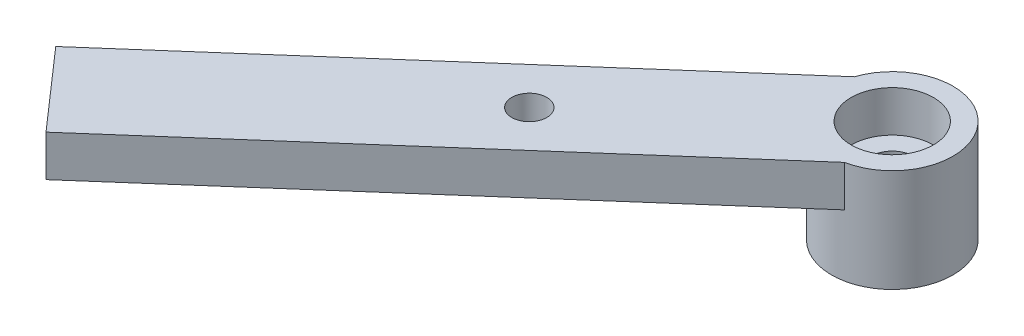
ISO-10303-21;
HEADER;
FILE_DESCRIPTION(('STEP AP214'),'2;1');
FILE_NAME('part.step','',(''),(''),'','','');
FILE_SCHEMA(('AUTOMOTIVE_DESIGN { 1 0 10303 214 1 1 1 1 }'));
ENDSEC;
DATA;
#1=APPLICATION_CONTEXT('core data for automotive mechanical design processes');
#2=APPLICATION_PROTOCOL_DEFINITION('international standard','automotive_design',2000,#1);
#3=PRODUCT_CONTEXT('',#1,'mechanical');
#4=PRODUCT('Part','Part','',(#3));
#5=PRODUCT_RELATED_PRODUCT_CATEGORY('part','',(#4));
#6=PRODUCT_DEFINITION_FORMATION('','',#4);
#7=PRODUCT_DEFINITION_CONTEXT('part definition',#1,'design');
#8=PRODUCT_DEFINITION('design','',#6,#7);
#9=PRODUCT_DEFINITION_SHAPE('','',#8);
#10=(LENGTH_UNIT() NAMED_UNIT(*) SI_UNIT(.MILLI.,.METRE.));
#11=(NAMED_UNIT(*) PLANE_ANGLE_UNIT() SI_UNIT($,.RADIAN.));
#12=(NAMED_UNIT(*) SI_UNIT($,.STERADIAN.) SOLID_ANGLE_UNIT());
#13=UNCERTAINTY_MEASURE_WITH_UNIT(LENGTH_MEASURE(1.E-05),#10,'distance_accuracy_value','');
#14=(GEOMETRIC_REPRESENTATION_CONTEXT(3) GLOBAL_UNCERTAINTY_ASSIGNED_CONTEXT((#13)) GLOBAL_UNIT_ASSIGNED_CONTEXT((#10,
#11,#12)) REPRESENTATION_CONTEXT('',''));
#15=CARTESIAN_POINT('',(0.,0.,0.));
#16=DIRECTION('',(0.,0.,1.));
#17=DIRECTION('',(1.,0.,0.));
#18=AXIS2_PLACEMENT_3D('',#15,#16,#17);
#19=CARTESIAN_POINT('',(-54.3717723606613,16.1569540318952,211.624669078813));
#20=DIRECTION('',(0.,1.,0.));
#21=DIRECTION('',(-1.,0.,0.));
#22=AXIS2_PLACEMENT_3D('',#19,#20,#21);
#23=PLANE('',#22);
#24=CARTESIAN_POINT('',(-73.1695544206689,16.1569540318952,228.106276695319));
#25=DIRECTION('',(0.,-1.,0.));
#26=DIRECTION('',(1.,0.,0.));
#27=AXIS2_PLACEMENT_3D('',#24,#25,#26);
#28=CIRCLE('',#27,1.70000000000001);
#29=CARTESIAN_POINT('',(-71.4695544206689,16.1569540318952,228.106276695319));
#30=VERTEX_POINT('',#29);
#31=EDGE_CURVE('E168',#30,#30,#28,.T.);
#32=ORIENTED_EDGE('',*,*,#31,.F.);
#33=EDGE_LOOP('',(#32));
#34=FACE_BOUND('',#33,.T.);
#35=CARTESIAN_POINT('',(-54.3717723606613,16.1569540318952,211.624669078813));
#36=DIRECTION('',(0.,-1.,0.));
#37=DIRECTION('',(1.,0.,0.));
#38=AXIS2_PLACEMENT_3D('',#35,#36,#37);
#39=CIRCLE('',#38,5.90000000000027);
#40=CARTESIAN_POINT('',(-53.2248893633556,16.1569540318952,217.412126153427));
#41=VERTEX_POINT('',#40);
#42=CARTESIAN_POINT('',(-59.9596082089397,16.1569540318952,209.730971496648));
#43=VERTEX_POINT('',#42);
#44=EDGE_CURVE('E88',#41,#43,#39,.T.);
#45=ORIENTED_EDGE('',*,*,#44,.F.);
#46=DIRECTION('',(0.751911282400303,0.,-0.659264304660227));
#47=VECTOR('',#46,1.);
#48=CARTESIAN_POINT('',(-94.5800098953721,16.1569540318952,253.671662909739));
#49=LINE('',#48,#47);
#50=CARTESIAN_POINT('',(-94.5800098953721,16.1569540318952,253.671662909739));
#51=VERTEX_POINT('',#50);
#52=EDGE_CURVE('E95',#51,#41,#49,.T.);
#53=ORIENTED_EDGE('',*,*,#52,.F.);
#54=DIRECTION('',(0.65926430466023,0.,0.7519112824003));
#55=VECTOR('',#54,1.);
#56=CARTESIAN_POINT('',(-101.314728740956,16.1569540318952,245.99050825296));
#57=LINE('',#56,#55);
#58=CARTESIAN_POINT('',(-101.314728740956,16.1569540318952,245.99050825296));
#59=VERTEX_POINT('',#58);
#60=EDGE_CURVE('E106',#59,#51,#57,.T.);
#61=ORIENTED_EDGE('',*,*,#60,.F.);
#62=DIRECTION('',(-0.751911282400303,0.,0.659264304660227));
#63=VECTOR('',#62,1.);
#64=CARTESIAN_POINT('',(-59.9596082089397,16.1569540318952,209.730971496648));
#65=LINE('',#64,#63);
#66=EDGE_CURVE('E97',#43,#59,#65,.T.);
#67=ORIENTED_EDGE('',*,*,#66,.F.);
#68=EDGE_LOOP('',(#45,#53,#61,#67));
#69=FACE_BOUND('',#68,.T.);
#70=ADVANCED_FACE('F48',(#34,#69),#23,.F.);
#71=CARTESIAN_POINT('',(-54.3717723606613,16.1569540318952,211.624669078813));
#72=DIRECTION('',(0.,1.,0.));
#73=DIRECTION('',(-1.,0.,0.));
#74=AXIS2_PLACEMENT_3D('',#71,#72,#73);
#75=CYLINDRICAL_SURFACE('',#74,5.90000000000026);
#76=CARTESIAN_POINT('',(-54.3717723606613,20.1569540318952,211.624669078813));
#77=DIRECTION('',(0.,1.,0.));
#78=DIRECTION('',(-1.,0.,0.));
#79=AXIS2_PLACEMENT_3D('',#76,#77,#78);
#80=CIRCLE('',#79,5.90000000000026);
#81=CARTESIAN_POINT('',(-53.2248893633556,20.1569540318952,217.412126153427));
#82=VERTEX_POINT('',#81);
#83=CARTESIAN_POINT('',(-59.9596082089397,20.1569540318952,209.730971496648));
#84=VERTEX_POINT('',#83);
#85=EDGE_CURVE('E103',#82,#84,#80,.T.);
#86=ORIENTED_EDGE('',*,*,#85,.F.);
#87=DIRECTION('',(0.,1.,0.));
#88=VECTOR('',#87,1.);
#89=CARTESIAN_POINT('',(-53.2248893633556,16.1569540318952,217.412126153427));
#90=LINE('',#89,#88);
#91=EDGE_CURVE('E12',#41,#82,#90,.T.);
#92=ORIENTED_EDGE('',*,*,#91,.F.);
#93=ORIENTED_EDGE('',*,*,#44,.T.);
#94=DIRECTION('',(0.,1.,0.));
#95=VECTOR('',#94,1.);
#96=CARTESIAN_POINT('',(-59.9596082089397,16.1569540318952,209.730971496648));
#97=LINE('',#96,#95);
#98=EDGE_CURVE('E52',#43,#84,#97,.T.);
#99=ORIENTED_EDGE('',*,*,#98,.T.);
#100=EDGE_LOOP('',(#86,#92,#93,#99));
#101=FACE_BOUND('',#100,.T.);
#102=CARTESIAN_POINT('',(-54.3717723606613,10.1569540318952,211.624669078813));
#103=DIRECTION('',(0.,-1.,0.));
#104=DIRECTION('',(1.,0.,0.));
#105=AXIS2_PLACEMENT_3D('',#102,#103,#104);
#106=CIRCLE('',#105,5.90000000000027);
#107=CARTESIAN_POINT('',(-48.471772360661,10.1569540318951,211.624669078813));
#108=VERTEX_POINT('',#107);
#109=EDGE_CURVE('E98',#108,#108,#106,.T.);
#110=ORIENTED_EDGE('',*,*,#109,.F.);
#111=EDGE_LOOP('',(#110));
#112=FACE_BOUND('',#111,.T.);
#113=ADVANCED_FACE('F50',(#101,#112),#75,.T.);
#114=CARTESIAN_POINT('',(-94.5800098953721,16.1569540318952,253.671662909739));
#115=DIRECTION('',(0.659264304660227,0.,0.751911282400303));
#116=DIRECTION('',(0.751911282400303,0.,-0.659264304660227));
#117=AXIS2_PLACEMENT_3D('',#114,#115,#116);
#118=PLANE('',#117);
#119=DIRECTION('',(0.751911282400303,0.,-0.659264304660227));
#120=VECTOR('',#119,1.);
#121=CARTESIAN_POINT('',(-94.5800098953721,20.1569540318952,253.671662909739));
#122=LINE('',#121,#120);
#123=CARTESIAN_POINT('',(-94.5800098953721,20.1569540318952,253.671662909739));
#124=VERTEX_POINT('',#123);
#125=EDGE_CURVE('E119',#124,#82,#122,.T.);
#126=ORIENTED_EDGE('',*,*,#125,.F.);
#127=DIRECTION('',(0.,1.,0.));
#128=VECTOR('',#127,1.);
#129=CARTESIAN_POINT('',(-94.5800098953721,16.1569540318952,253.671662909739));
#130=LINE('',#129,#128);
#131=EDGE_CURVE('E58',#51,#124,#130,.T.);
#132=ORIENTED_EDGE('',*,*,#131,.F.);
#133=ORIENTED_EDGE('',*,*,#52,.T.);
#134=ORIENTED_EDGE('',*,*,#91,.T.);
#135=EDGE_LOOP('',(#126,#132,#133,#134));
#136=FACE_BOUND('',#135,.T.);
#137=ADVANCED_FACE('F105',(#136),#118,.T.);
#138=CARTESIAN_POINT('',(-101.314728740956,16.1569540318952,245.99050825296));
#139=DIRECTION('',(-0.7519112824003,0.,0.65926430466023));
#140=DIRECTION('',(0.65926430466023,0.,0.7519112824003));
#141=AXIS2_PLACEMENT_3D('',#138,#139,#140);
#142=PLANE('',#141);
#143=DIRECTION('',(0.65926430466023,0.,0.7519112824003));
#144=VECTOR('',#143,1.);
#145=CARTESIAN_POINT('',(-101.314728740956,20.1569540318952,245.99050825296));
#146=LINE('',#145,#144);
#147=CARTESIAN_POINT('',(-101.314728740956,20.1569540318952,245.99050825296));
#148=VERTEX_POINT('',#147);
#149=EDGE_CURVE('E117',#148,#124,#146,.T.);
#150=ORIENTED_EDGE('',*,*,#149,.F.);
#151=DIRECTION('',(0.,1.,0.));
#152=VECTOR('',#151,1.);
#153=CARTESIAN_POINT('',(-101.314728740956,16.1569540318952,245.99050825296));
#154=LINE('',#153,#152);
#155=EDGE_CURVE('E108',#59,#148,#154,.T.);
#156=ORIENTED_EDGE('',*,*,#155,.F.);
#157=ORIENTED_EDGE('',*,*,#60,.T.);
#158=ORIENTED_EDGE('',*,*,#131,.T.);
#159=EDGE_LOOP('',(#150,#156,#157,#158));
#160=FACE_BOUND('',#159,.T.);
#161=ADVANCED_FACE('F124',(#160),#142,.T.);
#162=CARTESIAN_POINT('',(-59.9596082089397,16.1569540318952,209.730971496648));
#163=DIRECTION('',(-0.659264304660227,0.,-0.751911282400303));
#164=DIRECTION('',(-0.751911282400303,0.,0.659264304660227));
#165=AXIS2_PLACEMENT_3D('',#162,#163,#164);
#166=PLANE('',#165);
#167=DIRECTION('',(-0.751911282400303,0.,0.659264304660227));
#168=VECTOR('',#167,1.);
#169=CARTESIAN_POINT('',(-59.9596082089397,20.1569540318952,209.730971496648));
#170=LINE('',#169,#168);
#171=EDGE_CURVE('E113',#84,#148,#170,.T.);
#172=ORIENTED_EDGE('',*,*,#171,.F.);
#173=ORIENTED_EDGE('',*,*,#98,.F.);
#174=ORIENTED_EDGE('',*,*,#66,.T.);
#175=ORIENTED_EDGE('',*,*,#155,.T.);
#176=EDGE_LOOP('',(#172,#173,#174,#175));
#177=FACE_BOUND('',#176,.T.);
#178=ADVANCED_FACE('F123',(#177),#166,.T.);
#179=CARTESIAN_POINT('',(-54.3717723606613,20.1569540318952,211.624669078813));
#180=DIRECTION('',(0.,1.,0.));
#181=DIRECTION('',(-1.,0.,0.));
#182=AXIS2_PLACEMENT_3D('',#179,#180,#181);
#183=PLANE('',#182);
#184=CARTESIAN_POINT('',(-73.1695544206689,20.1569540318952,228.106276695319));
#185=DIRECTION('',(0.,1.,0.));
#186=DIRECTION('',(-1.,0.,0.));
#187=AXIS2_PLACEMENT_3D('',#184,#185,#186);
#188=CIRCLE('',#187,1.70000000000001);
#189=CARTESIAN_POINT('',(-74.8695544206689,20.1569540318952,228.106276695319));
#190=VERTEX_POINT('',#189);
#191=EDGE_CURVE('E170',#190,#190,#188,.F.);
#192=ORIENTED_EDGE('',*,*,#191,.T.);
#193=EDGE_LOOP('',(#192));
#194=FACE_BOUND('',#193,.T.);
#195=CARTESIAN_POINT('',(-54.3717723606613,20.1569540318952,211.624669078813));
#196=DIRECTION('',(0.,1.,0.));
#197=DIRECTION('',(-1.,0.,0.));
#198=AXIS2_PLACEMENT_3D('',#195,#196,#197);
#199=CIRCLE('',#198,4.00000000000001);
#200=CARTESIAN_POINT('',(-58.3717723606613,20.1569540318952,211.624669078813));
#201=VERTEX_POINT('',#200);
#202=EDGE_CURVE('E180',#201,#201,#199,.T.);
#203=ORIENTED_EDGE('',*,*,#202,.F.);
#204=EDGE_LOOP('',(#203));
#205=FACE_BOUND('',#204,.T.);
#206=ORIENTED_EDGE('',*,*,#85,.T.);
#207=ORIENTED_EDGE('',*,*,#171,.T.);
#208=ORIENTED_EDGE('',*,*,#149,.T.);
#209=ORIENTED_EDGE('',*,*,#125,.T.);
#210=EDGE_LOOP('',(#206,#207,#208,#209));
#211=FACE_BOUND('',#210,.T.);
#212=ADVANCED_FACE('F126',(#194,#205,#211),#183,.T.);
#213=CARTESIAN_POINT('',(-54.3717723606613,16.1569540318952,211.624669078813));
#214=DIRECTION('',(0.,1.,0.));
#215=DIRECTION('',(-1.,0.,0.));
#216=AXIS2_PLACEMENT_3D('',#213,#214,#215);
#217=CYLINDRICAL_SURFACE('',#216,4.00000000000001);
#218=CARTESIAN_POINT('',(-54.3717723606613,16.1569540318952,211.624669078813));
#219=DIRECTION('',(0.,1.,0.));
#220=DIRECTION('',(-1.,0.,0.));
#221=AXIS2_PLACEMENT_3D('',#218,#219,#220);
#222=CIRCLE('',#221,4.00000000000001);
#223=CARTESIAN_POINT('',(-58.3717723606613,16.1569540318952,211.624669078813));
#224=VERTEX_POINT('',#223);
#225=EDGE_CURVE('E114',#224,#224,#222,.T.);
#226=ORIENTED_EDGE('',*,*,#225,.F.);
#227=EDGE_LOOP('',(#226));
#228=FACE_BOUND('',#227,.T.);
#229=ORIENTED_EDGE('',*,*,#202,.T.);
#230=EDGE_LOOP('',(#229));
#231=FACE_BOUND('',#230,.T.);
#232=ADVANCED_FACE('F128',(#228,#231),#217,.F.);
#233=CARTESIAN_POINT('',(-54.3717723606613,16.1569540318952,211.624669078813));
#234=DIRECTION('',(0.,-1.,0.));
#235=DIRECTION('',(1.,0.,0.));
#236=AXIS2_PLACEMENT_3D('',#233,#234,#235);
#237=PLANE('',#236);
#238=CARTESIAN_POINT('',(-54.3717723606613,16.1569540318952,211.624669078813));
#239=DIRECTION('',(0.,-1.,0.));
#240=DIRECTION('',(1.,0.,0.));
#241=AXIS2_PLACEMENT_3D('',#238,#239,#240);
#242=CIRCLE('',#241,2.09999999999999);
#243=CARTESIAN_POINT('',(-52.2717723606613,16.1569540318952,211.624669078813));
#244=VERTEX_POINT('',#243);
#245=EDGE_CURVE('E171',#244,#244,#242,.T.);
#246=ORIENTED_EDGE('',*,*,#245,.T.);
#247=EDGE_LOOP('',(#246));
#248=FACE_BOUND('',#247,.T.);
#249=ORIENTED_EDGE('',*,*,#225,.T.);
#250=EDGE_LOOP('',(#249));
#251=FACE_BOUND('',#250,.T.);
#252=ADVANCED_FACE('F136',(#248,#251),#237,.F.);
#253=CARTESIAN_POINT('',(-54.3717723606613,10.1569540318952,211.624669078813));
#254=DIRECTION('',(0.,-1.,0.));
#255=DIRECTION('',(1.,0.,0.));
#256=AXIS2_PLACEMENT_3D('',#253,#254,#255);
#257=PLANE('',#256);
#258=ORIENTED_EDGE('',*,*,#109,.T.);
#259=EDGE_LOOP('',(#258));
#260=FACE_BOUND('',#259,.T.);
#261=CARTESIAN_POINT('',(-54.3717723606613,10.1569540318952,211.624669078813));
#262=DIRECTION('',(0.,-1.,0.));
#263=DIRECTION('',(1.,0.,0.));
#264=AXIS2_PLACEMENT_3D('',#261,#262,#263);
#265=CIRCLE('',#264,2.09999999999999);
#266=CARTESIAN_POINT('',(-52.2717723606613,10.1569540318952,211.624669078813));
#267=VERTEX_POINT('',#266);
#268=EDGE_CURVE('E99',#267,#267,#265,.T.);
#269=ORIENTED_EDGE('',*,*,#268,.F.);
#270=EDGE_LOOP('',(#269));
#271=FACE_BOUND('',#270,.T.);
#272=ADVANCED_FACE('F153',(#260,#271),#257,.T.);
#273=CARTESIAN_POINT('',(-54.3717723606613,10.1569540318952,211.624669078813));
#274=DIRECTION('',(0.,1.,0.));
#275=DIRECTION('',(-1.,0.,0.));
#276=AXIS2_PLACEMENT_3D('',#273,#274,#275);
#277=CYLINDRICAL_SURFACE('',#276,2.09999999999999);
#278=ORIENTED_EDGE('',*,*,#268,.T.);
#279=EDGE_LOOP('',(#278));
#280=FACE_BOUND('',#279,.T.);
#281=ORIENTED_EDGE('',*,*,#245,.F.);
#282=EDGE_LOOP('',(#281));
#283=FACE_BOUND('',#282,.T.);
#284=ADVANCED_FACE('F157',(#280,#283),#277,.F.);
#285=CARTESIAN_POINT('',(-73.1695544206689,24.9652801439637,228.106276695319));
#286=DIRECTION('',(0.,-1.,0.));
#287=DIRECTION('',(1.,0.,0.));
#288=AXIS2_PLACEMENT_3D('',#285,#286,#287);
#289=CYLINDRICAL_SURFACE('',#288,1.70000000000001);
#290=ORIENTED_EDGE('',*,*,#31,.T.);
#291=EDGE_LOOP('',(#290));
#292=FACE_BOUND('',#291,.T.);
#293=ORIENTED_EDGE('',*,*,#191,.F.);
#294=EDGE_LOOP('',(#293));
#295=FACE_BOUND('',#294,.T.);
#296=ADVANCED_FACE('F161',(#292,#295),#289,.F.);
#297=CLOSED_SHELL('',(#70,#113,#137,#161,#178,#212,#232,#252,#272,#284,#296));
#298=MANIFOLD_SOLID_BREP('B2',#297);
#299=ADVANCED_BREP_SHAPE_REPRESENTATION('',(#18,#298),#14);
#300=SHAPE_DEFINITION_REPRESENTATION(#9,#299);
ENDSEC;
END-ISO-10303-21;
